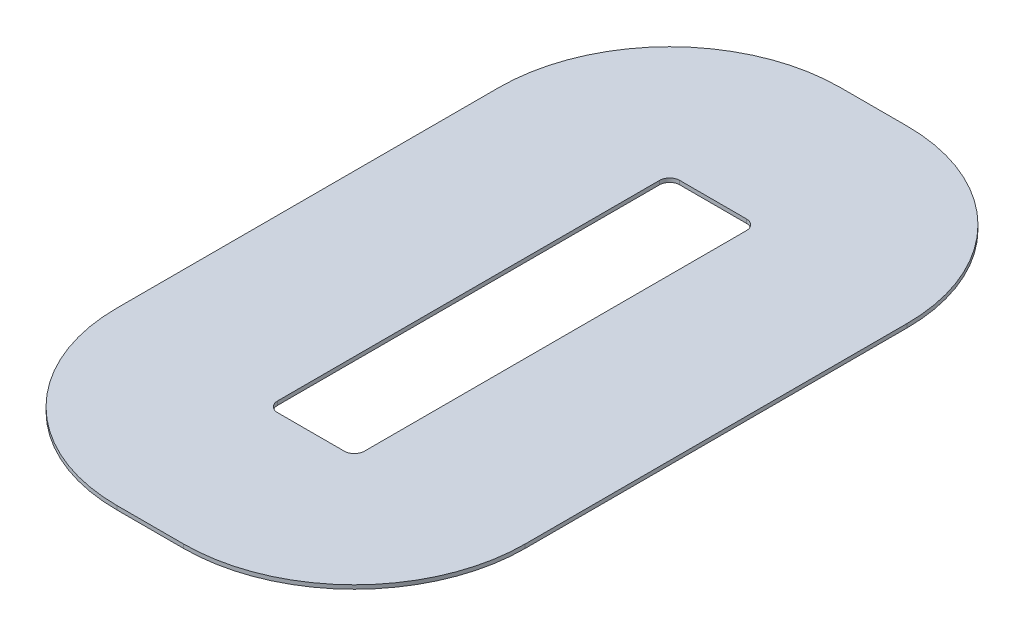
ISO-10303-21;
HEADER;
FILE_DESCRIPTION(('STEP AP214'),'2;1');
FILE_NAME('part.step','',(''),(''),'','','');
FILE_SCHEMA(('AUTOMOTIVE_DESIGN { 1 0 10303 214 1 1 1 1 }'));
ENDSEC;
DATA;
#1=APPLICATION_CONTEXT('core data for automotive mechanical design processes');
#2=APPLICATION_PROTOCOL_DEFINITION('international standard','automotive_design',2000,#1);
#3=PRODUCT_CONTEXT('',#1,'mechanical');
#4=PRODUCT('Part','Part','',(#3));
#5=PRODUCT_RELATED_PRODUCT_CATEGORY('part','',(#4));
#6=PRODUCT_DEFINITION_FORMATION('','',#4);
#7=PRODUCT_DEFINITION_CONTEXT('part definition',#1,'design');
#8=PRODUCT_DEFINITION('design','',#6,#7);
#9=PRODUCT_DEFINITION_SHAPE('','',#8);
#10=(LENGTH_UNIT() NAMED_UNIT(*) SI_UNIT(.MILLI.,.METRE.));
#11=(NAMED_UNIT(*) PLANE_ANGLE_UNIT() SI_UNIT($,.RADIAN.));
#12=(NAMED_UNIT(*) SI_UNIT($,.STERADIAN.) SOLID_ANGLE_UNIT());
#13=UNCERTAINTY_MEASURE_WITH_UNIT(LENGTH_MEASURE(1.E-05),#10,'distance_accuracy_value','');
#14=(GEOMETRIC_REPRESENTATION_CONTEXT(3) GLOBAL_UNCERTAINTY_ASSIGNED_CONTEXT((#13)) GLOBAL_UNIT_ASSIGNED_CONTEXT((#10,
#11,#12)) REPRESENTATION_CONTEXT('',''));
#15=CARTESIAN_POINT('',(0.,0.,0.));
#16=DIRECTION('',(0.,0.,1.));
#17=DIRECTION('',(1.,0.,0.));
#18=AXIS2_PLACEMENT_3D('',#15,#16,#17);
#19=CARTESIAN_POINT('',(4.30000000000001,-0.5,-24.6));
#20=DIRECTION('',(0.,1.,0.));
#21=DIRECTION('',(0.,0.,1.));
#22=AXIS2_PLACEMENT_3D('',#19,#20,#21);
#23=CYLINDRICAL_SURFACE('',#22,22.);
#24=CARTESIAN_POINT('',(4.30000000000001,0.,-24.6));
#25=DIRECTION('',(0.,1.,0.));
#26=DIRECTION('',(0.,0.,-1.));
#27=AXIS2_PLACEMENT_3D('',#24,#25,#26);
#28=CIRCLE('',#27,22.);
#29=CARTESIAN_POINT('',(26.3,0.,-24.5999999999998));
#30=VERTEX_POINT('',#29);
#31=CARTESIAN_POINT('',(4.29999999999985,0.,-46.6));
#32=VERTEX_POINT('',#31);
#33=EDGE_CURVE('E210',#30,#32,#28,.T.);
#34=ORIENTED_EDGE('',*,*,#33,.F.);
#35=DIRECTION('',(0.,1.,0.));
#36=VECTOR('',#35,1.);
#37=CARTESIAN_POINT('',(26.3,-0.5,-24.5999999999998));
#38=LINE('',#37,#36);
#39=CARTESIAN_POINT('',(26.3,-0.5,-24.5999999999998));
#40=VERTEX_POINT('',#39);
#41=EDGE_CURVE('E11',#40,#30,#38,.T.);
#42=ORIENTED_EDGE('',*,*,#41,.F.);
#43=CARTESIAN_POINT('',(4.30000000000001,-0.5,-24.6));
#44=DIRECTION('',(0.,1.,0.));
#45=DIRECTION('',(0.,0.,-1.));
#46=AXIS2_PLACEMENT_3D('',#43,#44,#45);
#47=CIRCLE('',#46,22.);
#48=CARTESIAN_POINT('',(4.29999999999985,-0.5,-46.6));
#49=VERTEX_POINT('',#48);
#50=EDGE_CURVE('E222',#40,#49,#47,.T.);
#51=ORIENTED_EDGE('',*,*,#50,.T.);
#52=DIRECTION('',(0.,1.,0.));
#53=VECTOR('',#52,1.);
#54=CARTESIAN_POINT('',(4.29999999999985,-0.5,-46.6));
#55=LINE('',#54,#53);
#56=EDGE_CURVE('E43',#49,#32,#55,.T.);
#57=ORIENTED_EDGE('',*,*,#56,.T.);
#58=EDGE_LOOP('',(#34,#42,#51,#57));
#59=FACE_BOUND('',#58,.T.);
#60=ADVANCED_FACE('F40',(#59),#23,.T.);
#61=CARTESIAN_POINT('',(26.3,-0.5,-24.5999999999998));
#62=DIRECTION('',(1.,0.,0.));
#63=DIRECTION('',(0.,0.,-1.));
#64=AXIS2_PLACEMENT_3D('',#61,#62,#63);
#65=PLANE('',#64);
#66=DIRECTION('',(0.,0.,-1.));
#67=VECTOR('',#66,1.);
#68=CARTESIAN_POINT('',(26.3,0.,-24.5999999999998));
#69=LINE('',#68,#67);
#70=CARTESIAN_POINT('',(26.3,0.,24.5999999999999));
#71=VERTEX_POINT('',#70);
#72=EDGE_CURVE('E226',#71,#30,#69,.T.);
#73=ORIENTED_EDGE('',*,*,#72,.F.);
#74=DIRECTION('',(0.,1.,0.));
#75=VECTOR('',#74,1.);
#76=CARTESIAN_POINT('',(26.3,-0.5,24.5999999999999));
#77=LINE('',#76,#75);
#78=CARTESIAN_POINT('',(26.3,-0.5,24.5999999999999));
#79=VERTEX_POINT('',#78);
#80=EDGE_CURVE('E48',#79,#71,#77,.T.);
#81=ORIENTED_EDGE('',*,*,#80,.F.);
#82=DIRECTION('',(0.,0.,-1.));
#83=VECTOR('',#82,1.);
#84=CARTESIAN_POINT('',(26.3,-0.5,-24.5999999999998));
#85=LINE('',#84,#83);
#86=EDGE_CURVE('E244',#79,#40,#85,.T.);
#87=ORIENTED_EDGE('',*,*,#86,.T.);
#88=ORIENTED_EDGE('',*,*,#41,.T.);
#89=EDGE_LOOP('',(#73,#81,#87,#88));
#90=FACE_BOUND('',#89,.T.);
#91=ADVANCED_FACE('F291',(#90),#65,.T.);
#92=CARTESIAN_POINT('',(4.30000000000001,-0.5,24.6));
#93=DIRECTION('',(0.,1.,0.));
#94=DIRECTION('',(0.,0.,1.));
#95=AXIS2_PLACEMENT_3D('',#92,#93,#94);
#96=CYLINDRICAL_SURFACE('',#95,22.);
#97=CARTESIAN_POINT('',(4.30000000000001,0.,24.6));
#98=DIRECTION('',(0.,1.,0.));
#99=DIRECTION('',(0.,0.,1.));
#100=AXIS2_PLACEMENT_3D('',#97,#98,#99);
#101=CIRCLE('',#100,22.);
#102=CARTESIAN_POINT('',(4.29999999999985,0.,46.6));
#103=VERTEX_POINT('',#102);
#104=EDGE_CURVE('E264',#103,#71,#101,.T.);
#105=ORIENTED_EDGE('',*,*,#104,.F.);
#106=DIRECTION('',(0.,1.,0.));
#107=VECTOR('',#106,1.);
#108=CARTESIAN_POINT('',(4.29999999999985,-0.5,46.6));
#109=LINE('',#108,#107);
#110=CARTESIAN_POINT('',(4.29999999999985,-0.5,46.6));
#111=VERTEX_POINT('',#110);
#112=EDGE_CURVE('E270',#111,#103,#109,.T.);
#113=ORIENTED_EDGE('',*,*,#112,.F.);
#114=CARTESIAN_POINT('',(4.30000000000001,-0.5,24.6));
#115=DIRECTION('',(0.,1.,0.));
#116=DIRECTION('',(0.,0.,1.));
#117=AXIS2_PLACEMENT_3D('',#114,#115,#116);
#118=CIRCLE('',#117,22.);
#119=EDGE_CURVE('E241',#111,#79,#118,.T.);
#120=ORIENTED_EDGE('',*,*,#119,.T.);
#121=ORIENTED_EDGE('',*,*,#80,.T.);
#122=EDGE_LOOP('',(#105,#113,#120,#121));
#123=FACE_BOUND('',#122,.T.);
#124=ADVANCED_FACE('F310',(#123),#96,.T.);
#125=CARTESIAN_POINT('',(-4.29999999999984,-0.5,46.6));
#126=DIRECTION('',(0.,0.,1.));
#127=DIRECTION('',(1.,0.,0.));
#128=AXIS2_PLACEMENT_3D('',#125,#126,#127);
#129=PLANE('',#128);
#130=DIRECTION('',(1.,0.,0.));
#131=VECTOR('',#130,1.);
#132=CARTESIAN_POINT('',(-4.29999999999984,0.,46.6));
#133=LINE('',#132,#131);
#134=CARTESIAN_POINT('',(-4.29999999999999,0.,46.6));
#135=VERTEX_POINT('',#134);
#136=EDGE_CURVE('E261',#135,#103,#133,.T.);
#137=ORIENTED_EDGE('',*,*,#136,.F.);
#138=DIRECTION('',(0.,1.,0.));
#139=VECTOR('',#138,1.);
#140=CARTESIAN_POINT('',(-4.29999999999999,-0.5,46.6));
#141=LINE('',#140,#139);
#142=CARTESIAN_POINT('',(-4.29999999999999,-0.5,46.6));
#143=VERTEX_POINT('',#142);
#144=EDGE_CURVE('E272',#143,#135,#141,.T.);
#145=ORIENTED_EDGE('',*,*,#144,.F.);
#146=DIRECTION('',(1.,0.,0.));
#147=VECTOR('',#146,1.);
#148=CARTESIAN_POINT('',(-4.29999999999984,-0.5,46.6));
#149=LINE('',#148,#147);
#150=EDGE_CURVE('E238',#143,#111,#149,.T.);
#151=ORIENTED_EDGE('',*,*,#150,.T.);
#152=ORIENTED_EDGE('',*,*,#112,.T.);
#153=EDGE_LOOP('',(#137,#145,#151,#152));
#154=FACE_BOUND('',#153,.T.);
#155=ADVANCED_FACE('F308',(#154),#129,.T.);
#156=CARTESIAN_POINT('',(-4.29999999999999,-0.5,24.6));
#157=DIRECTION('',(0.,1.,0.));
#158=DIRECTION('',(0.,0.,1.));
#159=AXIS2_PLACEMENT_3D('',#156,#157,#158);
#160=CYLINDRICAL_SURFACE('',#159,22.);
#161=CARTESIAN_POINT('',(-4.29999999999999,0.,24.6));
#162=DIRECTION('',(0.,1.,0.));
#163=DIRECTION('',(0.,0.,1.));
#164=AXIS2_PLACEMENT_3D('',#161,#162,#163);
#165=CIRCLE('',#164,22.);
#166=CARTESIAN_POINT('',(-26.3,0.,24.5999999999999));
#167=VERTEX_POINT('',#166);
#168=EDGE_CURVE('E258',#167,#135,#165,.T.);
#169=ORIENTED_EDGE('',*,*,#168,.F.);
#170=DIRECTION('',(0.,1.,0.));
#171=VECTOR('',#170,1.);
#172=CARTESIAN_POINT('',(-26.3,-0.5,24.5999999999999));
#173=LINE('',#172,#171);
#174=CARTESIAN_POINT('',(-26.3,-0.5,24.5999999999999));
#175=VERTEX_POINT('',#174);
#176=EDGE_CURVE('E274',#175,#167,#173,.T.);
#177=ORIENTED_EDGE('',*,*,#176,.F.);
#178=CARTESIAN_POINT('',(-4.29999999999999,-0.5,24.6));
#179=DIRECTION('',(0.,1.,0.));
#180=DIRECTION('',(0.,0.,1.));
#181=AXIS2_PLACEMENT_3D('',#178,#179,#180);
#182=CIRCLE('',#181,22.);
#183=EDGE_CURVE('E235',#175,#143,#182,.T.);
#184=ORIENTED_EDGE('',*,*,#183,.T.);
#185=ORIENTED_EDGE('',*,*,#144,.T.);
#186=EDGE_LOOP('',(#169,#177,#184,#185));
#187=FACE_BOUND('',#186,.T.);
#188=ADVANCED_FACE('F304',(#187),#160,.T.);
#189=CARTESIAN_POINT('',(-26.3,-0.5,-24.5999999999998));
#190=DIRECTION('',(-1.,0.,0.));
#191=DIRECTION('',(0.,0.,1.));
#192=AXIS2_PLACEMENT_3D('',#189,#190,#191);
#193=PLANE('',#192);
#194=DIRECTION('',(0.,0.,1.));
#195=VECTOR('',#194,1.);
#196=CARTESIAN_POINT('',(-26.3,0.,-24.5999999999998));
#197=LINE('',#196,#195);
#198=CARTESIAN_POINT('',(-26.3,0.,-24.5999999999999));
#199=VERTEX_POINT('',#198);
#200=EDGE_CURVE('E255',#199,#167,#197,.T.);
#201=ORIENTED_EDGE('',*,*,#200,.F.);
#202=DIRECTION('',(0.,1.,0.));
#203=VECTOR('',#202,1.);
#204=CARTESIAN_POINT('',(-26.3,-0.5,-24.5999999999999));
#205=LINE('',#204,#203);
#206=CARTESIAN_POINT('',(-26.3,-0.5,-24.5999999999999));
#207=VERTEX_POINT('',#206);
#208=EDGE_CURVE('E276',#207,#199,#205,.T.);
#209=ORIENTED_EDGE('',*,*,#208,.F.);
#210=DIRECTION('',(0.,0.,1.));
#211=VECTOR('',#210,1.);
#212=CARTESIAN_POINT('',(-26.3,-0.5,-24.5999999999998));
#213=LINE('',#212,#211);
#214=EDGE_CURVE('E232',#207,#175,#213,.T.);
#215=ORIENTED_EDGE('',*,*,#214,.T.);
#216=ORIENTED_EDGE('',*,*,#176,.T.);
#217=EDGE_LOOP('',(#201,#209,#215,#216));
#218=FACE_BOUND('',#217,.T.);
#219=ADVANCED_FACE('F302',(#218),#193,.T.);
#220=CARTESIAN_POINT('',(-4.30000000000001,-0.5,-24.6));
#221=DIRECTION('',(0.,1.,0.));
#222=DIRECTION('',(0.,0.,1.));
#223=AXIS2_PLACEMENT_3D('',#220,#221,#222);
#224=CYLINDRICAL_SURFACE('',#223,22.);
#225=CARTESIAN_POINT('',(-4.30000000000001,0.,-24.6));
#226=DIRECTION('',(0.,1.,0.));
#227=DIRECTION('',(0.,0.,1.));
#228=AXIS2_PLACEMENT_3D('',#225,#226,#227);
#229=CIRCLE('',#228,22.);
#230=CARTESIAN_POINT('',(-4.29999999999985,0.,-46.6));
#231=VERTEX_POINT('',#230);
#232=EDGE_CURVE('E252',#231,#199,#229,.T.);
#233=ORIENTED_EDGE('',*,*,#232,.F.);
#234=DIRECTION('',(0.,1.,0.));
#235=VECTOR('',#234,1.);
#236=CARTESIAN_POINT('',(-4.29999999999985,-0.5,-46.6));
#237=LINE('',#236,#235);
#238=CARTESIAN_POINT('',(-4.29999999999985,-0.5,-46.6));
#239=VERTEX_POINT('',#238);
#240=EDGE_CURVE('E277',#239,#231,#237,.T.);
#241=ORIENTED_EDGE('',*,*,#240,.F.);
#242=CARTESIAN_POINT('',(-4.30000000000001,-0.5,-24.6));
#243=DIRECTION('',(0.,1.,0.));
#244=DIRECTION('',(0.,0.,1.));
#245=AXIS2_PLACEMENT_3D('',#242,#243,#244);
#246=CIRCLE('',#245,22.);
#247=EDGE_CURVE('E229',#239,#207,#246,.T.);
#248=ORIENTED_EDGE('',*,*,#247,.T.);
#249=ORIENTED_EDGE('',*,*,#208,.T.);
#250=EDGE_LOOP('',(#233,#241,#248,#249));
#251=FACE_BOUND('',#250,.T.);
#252=ADVANCED_FACE('F298',(#251),#224,.T.);
#253=CARTESIAN_POINT('',(-4.29999999999985,-0.5,-46.6));
#254=DIRECTION('',(0.,0.,-1.));
#255=DIRECTION('',(-1.,0.,0.));
#256=AXIS2_PLACEMENT_3D('',#253,#254,#255);
#257=PLANE('',#256);
#258=DIRECTION('',(-1.,0.,0.));
#259=VECTOR('',#258,1.);
#260=CARTESIAN_POINT('',(-4.29999999999985,0.,-46.6));
#261=LINE('',#260,#259);
#262=EDGE_CURVE('E249',#32,#231,#261,.T.);
#263=ORIENTED_EDGE('',*,*,#262,.F.);
#264=ORIENTED_EDGE('',*,*,#56,.F.);
#265=DIRECTION('',(-1.,0.,0.));
#266=VECTOR('',#265,1.);
#267=CARTESIAN_POINT('',(-4.29999999999985,-0.5,-46.6));
#268=LINE('',#267,#266);
#269=EDGE_CURVE('E225',#49,#239,#268,.T.);
#270=ORIENTED_EDGE('',*,*,#269,.T.);
#271=ORIENTED_EDGE('',*,*,#240,.T.);
#272=EDGE_LOOP('',(#263,#264,#270,#271));
#273=FACE_BOUND('',#272,.T.);
#274=ADVANCED_FACE('F285',(#273),#257,.T.);
#275=CARTESIAN_POINT('',(4.30000000000001,-0.5,-24.6));
#276=DIRECTION('',(0.,-1.,0.));
#277=DIRECTION('',(0.,0.,-1.));
#278=AXIS2_PLACEMENT_3D('',#275,#276,#277);
#279=PLANE('',#278);
#280=CARTESIAN_POINT('',(4.30000000000001,-0.5,24.6));
#281=DIRECTION('',(0.,1.,0.));
#282=DIRECTION('',(0.,0.,1.));
#283=AXIS2_PLACEMENT_3D('',#280,#281,#282);
#284=CIRCLE('',#283,1.3);
#285=CARTESIAN_POINT('',(4.3,-0.5,25.9));
#286=VERTEX_POINT('',#285);
#287=CARTESIAN_POINT('',(5.60000000000001,-0.5,24.6));
#288=VERTEX_POINT('',#287);
#289=EDGE_CURVE('E155',#286,#288,#284,.T.);
#290=ORIENTED_EDGE('',*,*,#289,.T.);
#291=DIRECTION('',(0.,0.,-1.));
#292=VECTOR('',#291,1.);
#293=CARTESIAN_POINT('',(5.6,-0.5,-24.6));
#294=LINE('',#293,#292);
#295=CARTESIAN_POINT('',(5.6,-0.5,-24.6));
#296=VERTEX_POINT('',#295);
#297=EDGE_CURVE('E164',#288,#296,#294,.T.);
#298=ORIENTED_EDGE('',*,*,#297,.T.);
#299=CARTESIAN_POINT('',(4.3,-0.5,-24.6));
#300=DIRECTION('',(0.,1.,0.));
#301=DIRECTION('',(0.,0.,-1.));
#302=AXIS2_PLACEMENT_3D('',#299,#300,#301);
#303=CIRCLE('',#302,1.3);
#304=CARTESIAN_POINT('',(4.29999999999999,-0.5,-25.9));
#305=VERTEX_POINT('',#304);
#306=EDGE_CURVE('E56',#296,#305,#303,.T.);
#307=ORIENTED_EDGE('',*,*,#306,.T.);
#308=DIRECTION('',(-1.,0.,0.));
#309=VECTOR('',#308,1.);
#310=CARTESIAN_POINT('',(-4.3,-0.5,-25.9));
#311=LINE('',#310,#309);
#312=CARTESIAN_POINT('',(-4.3,-0.5,-25.9));
#313=VERTEX_POINT('',#312);
#314=EDGE_CURVE('E179',#305,#313,#311,.T.);
#315=ORIENTED_EDGE('',*,*,#314,.T.);
#316=CARTESIAN_POINT('',(-4.30000000000001,-0.5,-24.6));
#317=DIRECTION('',(0.,1.,0.));
#318=DIRECTION('',(0.,0.,1.));
#319=AXIS2_PLACEMENT_3D('',#316,#317,#318);
#320=CIRCLE('',#319,1.3);
#321=CARTESIAN_POINT('',(-5.60000000000001,-0.5,-24.6));
#322=VERTEX_POINT('',#321);
#323=EDGE_CURVE('E182',#313,#322,#320,.T.);
#324=ORIENTED_EDGE('',*,*,#323,.T.);
#325=DIRECTION('',(0.,0.,1.));
#326=VECTOR('',#325,1.);
#327=CARTESIAN_POINT('',(-5.60000000000001,-0.5,-24.6));
#328=LINE('',#327,#326);
#329=CARTESIAN_POINT('',(-5.6,-0.5,24.6));
#330=VERTEX_POINT('',#329);
#331=EDGE_CURVE('E185',#322,#330,#328,.T.);
#332=ORIENTED_EDGE('',*,*,#331,.T.);
#333=CARTESIAN_POINT('',(-4.3,-0.5,24.6));
#334=DIRECTION('',(0.,1.,0.));
#335=DIRECTION('',(0.,0.,1.));
#336=AXIS2_PLACEMENT_3D('',#333,#334,#335);
#337=CIRCLE('',#336,1.3);
#338=CARTESIAN_POINT('',(-4.29999999999999,-0.5,25.9));
#339=VERTEX_POINT('',#338);
#340=EDGE_CURVE('E188',#330,#339,#337,.T.);
#341=ORIENTED_EDGE('',*,*,#340,.T.);
#342=DIRECTION('',(1.,0.,0.));
#343=VECTOR('',#342,1.);
#344=CARTESIAN_POINT('',(-4.29999999999999,-0.5,25.9));
#345=LINE('',#344,#343);
#346=EDGE_CURVE('E161',#339,#286,#345,.T.);
#347=ORIENTED_EDGE('',*,*,#346,.T.);
#348=EDGE_LOOP('',(#290,#298,#307,#315,#324,#332,#341,#347));
#349=FACE_BOUND('',#348,.T.);
#350=ORIENTED_EDGE('',*,*,#50,.F.);
#351=ORIENTED_EDGE('',*,*,#86,.F.);
#352=ORIENTED_EDGE('',*,*,#119,.F.);
#353=ORIENTED_EDGE('',*,*,#150,.F.);
#354=ORIENTED_EDGE('',*,*,#183,.F.);
#355=ORIENTED_EDGE('',*,*,#214,.F.);
#356=ORIENTED_EDGE('',*,*,#247,.F.);
#357=ORIENTED_EDGE('',*,*,#269,.F.);
#358=EDGE_LOOP('',(#350,#351,#352,#353,#354,#355,#356,#357));
#359=FACE_BOUND('',#358,.T.);
#360=ADVANCED_FACE('F168',(#349,#359),#279,.T.);
#361=CARTESIAN_POINT('',(4.30000000000001,0.,-24.6));
#362=DIRECTION('',(0.,-1.,0.));
#363=DIRECTION('',(0.,0.,-1.));
#364=AXIS2_PLACEMENT_3D('',#361,#362,#363);
#365=PLANE('',#364);
#366=DIRECTION('',(0.,0.,-1.));
#367=VECTOR('',#366,1.);
#368=CARTESIAN_POINT('',(5.6,0.,-24.6));
#369=LINE('',#368,#367);
#370=CARTESIAN_POINT('',(5.60000000000001,0.,24.6));
#371=VERTEX_POINT('',#370);
#372=CARTESIAN_POINT('',(5.6,0.,-24.6));
#373=VERTEX_POINT('',#372);
#374=EDGE_CURVE('E192',#371,#373,#369,.T.);
#375=ORIENTED_EDGE('',*,*,#374,.F.);
#376=CARTESIAN_POINT('',(4.30000000000001,0.,24.6));
#377=DIRECTION('',(0.,1.,0.));
#378=DIRECTION('',(0.,0.,1.));
#379=AXIS2_PLACEMENT_3D('',#376,#377,#378);
#380=CIRCLE('',#379,1.3);
#381=CARTESIAN_POINT('',(4.3,0.,25.9));
#382=VERTEX_POINT('',#381);
#383=EDGE_CURVE('E64',#382,#371,#380,.T.);
#384=ORIENTED_EDGE('',*,*,#383,.F.);
#385=DIRECTION('',(1.,0.,0.));
#386=VECTOR('',#385,1.);
#387=CARTESIAN_POINT('',(-4.29999999999999,0.,25.9));
#388=LINE('',#387,#386);
#389=CARTESIAN_POINT('',(-4.29999999999999,0.,25.9));
#390=VERTEX_POINT('',#389);
#391=EDGE_CURVE('E172',#390,#382,#388,.T.);
#392=ORIENTED_EDGE('',*,*,#391,.F.);
#393=CARTESIAN_POINT('',(-4.3,0.,24.6));
#394=DIRECTION('',(0.,1.,0.));
#395=DIRECTION('',(0.,0.,1.));
#396=AXIS2_PLACEMENT_3D('',#393,#394,#395);
#397=CIRCLE('',#396,1.3);
#398=CARTESIAN_POINT('',(-5.6,0.,24.6));
#399=VERTEX_POINT('',#398);
#400=EDGE_CURVE('E175',#399,#390,#397,.T.);
#401=ORIENTED_EDGE('',*,*,#400,.F.);
#402=DIRECTION('',(0.,0.,1.));
#403=VECTOR('',#402,1.);
#404=CARTESIAN_POINT('',(-5.60000000000001,0.,-24.6));
#405=LINE('',#404,#403);
#406=CARTESIAN_POINT('',(-5.60000000000001,0.,-24.6));
#407=VERTEX_POINT('',#406);
#408=EDGE_CURVE('E203',#407,#399,#405,.T.);
#409=ORIENTED_EDGE('',*,*,#408,.F.);
#410=CARTESIAN_POINT('',(-4.30000000000001,0.,-24.6));
#411=DIRECTION('',(0.,1.,0.));
#412=DIRECTION('',(0.,0.,1.));
#413=AXIS2_PLACEMENT_3D('',#410,#411,#412);
#414=CIRCLE('',#413,1.3);
#415=CARTESIAN_POINT('',(-4.3,0.,-25.9));
#416=VERTEX_POINT('',#415);
#417=EDGE_CURVE('E200',#416,#407,#414,.T.);
#418=ORIENTED_EDGE('',*,*,#417,.F.);
#419=DIRECTION('',(-1.,0.,0.));
#420=VECTOR('',#419,1.);
#421=CARTESIAN_POINT('',(-4.3,0.,-25.9));
#422=LINE('',#421,#420);
#423=CARTESIAN_POINT('',(4.29999999999999,0.,-25.9));
#424=VERTEX_POINT('',#423);
#425=EDGE_CURVE('E197',#424,#416,#422,.T.);
#426=ORIENTED_EDGE('',*,*,#425,.F.);
#427=CARTESIAN_POINT('',(4.3,0.,-24.6));
#428=DIRECTION('',(0.,1.,0.));
#429=DIRECTION('',(0.,0.,-1.));
#430=AXIS2_PLACEMENT_3D('',#427,#428,#429);
#431=CIRCLE('',#430,1.3);
#432=EDGE_CURVE('E194',#373,#424,#431,.T.);
#433=ORIENTED_EDGE('',*,*,#432,.F.);
#434=EDGE_LOOP('',(#375,#384,#392,#401,#409,#418,#426,#433));
#435=FACE_BOUND('',#434,.T.);
#436=ORIENTED_EDGE('',*,*,#33,.T.);
#437=ORIENTED_EDGE('',*,*,#262,.T.);
#438=ORIENTED_EDGE('',*,*,#232,.T.);
#439=ORIENTED_EDGE('',*,*,#200,.T.);
#440=ORIENTED_EDGE('',*,*,#168,.T.);
#441=ORIENTED_EDGE('',*,*,#136,.T.);
#442=ORIENTED_EDGE('',*,*,#104,.T.);
#443=ORIENTED_EDGE('',*,*,#72,.T.);
#444=EDGE_LOOP('',(#436,#437,#438,#439,#440,#441,#442,#443));
#445=FACE_BOUND('',#444,.T.);
#446=ADVANCED_FACE('F287',(#435,#445),#365,.F.);
#447=CARTESIAN_POINT('',(4.30000000000001,-0.5,24.6));
#448=DIRECTION('',(0.,1.,0.));
#449=DIRECTION('',(0.,0.,1.));
#450=AXIS2_PLACEMENT_3D('',#447,#448,#449);
#451=CYLINDRICAL_SURFACE('',#450,1.3);
#452=ORIENTED_EDGE('',*,*,#383,.T.);
#453=DIRECTION('',(0.,1.,0.));
#454=VECTOR('',#453,1.);
#455=CARTESIAN_POINT('',(5.60000000000001,-0.5,24.6));
#456=LINE('',#455,#454);
#457=EDGE_CURVE('E151',#288,#371,#456,.T.);
#458=ORIENTED_EDGE('',*,*,#457,.F.);
#459=ORIENTED_EDGE('',*,*,#289,.F.);
#460=DIRECTION('',(0.,1.,0.));
#461=VECTOR('',#460,1.);
#462=CARTESIAN_POINT('',(4.3,-0.5,25.9));
#463=LINE('',#462,#461);
#464=EDGE_CURVE('E208',#286,#382,#463,.T.);
#465=ORIENTED_EDGE('',*,*,#464,.T.);
#466=EDGE_LOOP('',(#452,#458,#459,#465));
#467=FACE_BOUND('',#466,.T.);
#468=ADVANCED_FACE('F153',(#467),#451,.F.);
#469=CARTESIAN_POINT('',(-4.29999999999999,-0.5,25.9));
#470=DIRECTION('',(0.,0.,1.));
#471=DIRECTION('',(1.,0.,0.));
#472=AXIS2_PLACEMENT_3D('',#469,#470,#471);
#473=PLANE('',#472);
#474=ORIENTED_EDGE('',*,*,#391,.T.);
#475=ORIENTED_EDGE('',*,*,#464,.F.);
#476=ORIENTED_EDGE('',*,*,#346,.F.);
#477=DIRECTION('',(0.,1.,0.));
#478=VECTOR('',#477,1.);
#479=CARTESIAN_POINT('',(-4.29999999999999,-0.5,25.9));
#480=LINE('',#479,#478);
#481=EDGE_CURVE('E211',#339,#390,#480,.T.);
#482=ORIENTED_EDGE('',*,*,#481,.T.);
#483=EDGE_LOOP('',(#474,#475,#476,#482));
#484=FACE_BOUND('',#483,.T.);
#485=ADVANCED_FACE('F402',(#484),#473,.F.);
#486=CARTESIAN_POINT('',(-4.3,-0.5,24.6));
#487=DIRECTION('',(0.,1.,0.));
#488=DIRECTION('',(0.,0.,1.));
#489=AXIS2_PLACEMENT_3D('',#486,#487,#488);
#490=CYLINDRICAL_SURFACE('',#489,1.3);
#491=ORIENTED_EDGE('',*,*,#400,.T.);
#492=ORIENTED_EDGE('',*,*,#481,.F.);
#493=ORIENTED_EDGE('',*,*,#340,.F.);
#494=DIRECTION('',(0.,1.,0.));
#495=VECTOR('',#494,1.);
#496=CARTESIAN_POINT('',(-5.6,-0.5,24.6));
#497=LINE('',#496,#495);
#498=EDGE_CURVE('E213',#330,#399,#497,.T.);
#499=ORIENTED_EDGE('',*,*,#498,.T.);
#500=EDGE_LOOP('',(#491,#492,#493,#499));
#501=FACE_BOUND('',#500,.T.);
#502=ADVANCED_FACE('F412',(#501),#490,.F.);
#503=CARTESIAN_POINT('',(-5.60000000000001,-0.5,-24.6));
#504=DIRECTION('',(-1.,0.,0.));
#505=DIRECTION('',(0.,0.,1.));
#506=AXIS2_PLACEMENT_3D('',#503,#504,#505);
#507=PLANE('',#506);
#508=ORIENTED_EDGE('',*,*,#408,.T.);
#509=ORIENTED_EDGE('',*,*,#498,.F.);
#510=ORIENTED_EDGE('',*,*,#331,.F.);
#511=DIRECTION('',(0.,1.,0.));
#512=VECTOR('',#511,1.);
#513=CARTESIAN_POINT('',(-5.60000000000001,-0.5,-24.6));
#514=LINE('',#513,#512);
#515=EDGE_CURVE('E215',#322,#407,#514,.T.);
#516=ORIENTED_EDGE('',*,*,#515,.T.);
#517=EDGE_LOOP('',(#508,#509,#510,#516));
#518=FACE_BOUND('',#517,.T.);
#519=ADVANCED_FACE('F423',(#518),#507,.F.);
#520=CARTESIAN_POINT('',(-4.30000000000001,-0.5,-24.6));
#521=DIRECTION('',(0.,1.,0.));
#522=DIRECTION('',(0.,0.,1.));
#523=AXIS2_PLACEMENT_3D('',#520,#521,#522);
#524=CYLINDRICAL_SURFACE('',#523,1.3);
#525=ORIENTED_EDGE('',*,*,#417,.T.);
#526=ORIENTED_EDGE('',*,*,#515,.F.);
#527=ORIENTED_EDGE('',*,*,#323,.F.);
#528=DIRECTION('',(0.,1.,0.));
#529=VECTOR('',#528,1.);
#530=CARTESIAN_POINT('',(-4.3,-0.5,-25.9));
#531=LINE('',#530,#529);
#532=EDGE_CURVE('E217',#313,#416,#531,.T.);
#533=ORIENTED_EDGE('',*,*,#532,.T.);
#534=EDGE_LOOP('',(#525,#526,#527,#533));
#535=FACE_BOUND('',#534,.T.);
#536=ADVANCED_FACE('F434',(#535),#524,.F.);
#537=CARTESIAN_POINT('',(-4.3,-0.5,-25.9));
#538=DIRECTION('',(0.,0.,-1.));
#539=DIRECTION('',(-1.,0.,0.));
#540=AXIS2_PLACEMENT_3D('',#537,#538,#539);
#541=PLANE('',#540);
#542=ORIENTED_EDGE('',*,*,#425,.T.);
#543=ORIENTED_EDGE('',*,*,#532,.F.);
#544=ORIENTED_EDGE('',*,*,#314,.F.);
#545=DIRECTION('',(0.,1.,0.));
#546=VECTOR('',#545,1.);
#547=CARTESIAN_POINT('',(4.29999999999999,-0.5,-25.9));
#548=LINE('',#547,#546);
#549=EDGE_CURVE('E219',#305,#424,#548,.T.);
#550=ORIENTED_EDGE('',*,*,#549,.T.);
#551=EDGE_LOOP('',(#542,#543,#544,#550));
#552=FACE_BOUND('',#551,.T.);
#553=ADVANCED_FACE('F445',(#552),#541,.F.);
#554=CARTESIAN_POINT('',(4.3,-0.5,-24.6));
#555=DIRECTION('',(0.,1.,0.));
#556=DIRECTION('',(0.,0.,1.));
#557=AXIS2_PLACEMENT_3D('',#554,#555,#556);
#558=CYLINDRICAL_SURFACE('',#557,1.3);
#559=ORIENTED_EDGE('',*,*,#432,.T.);
#560=ORIENTED_EDGE('',*,*,#549,.F.);
#561=ORIENTED_EDGE('',*,*,#306,.F.);
#562=DIRECTION('',(0.,1.,0.));
#563=VECTOR('',#562,1.);
#564=CARTESIAN_POINT('',(5.6,-0.5,-24.6));
#565=LINE('',#564,#563);
#566=EDGE_CURVE('E160',#296,#373,#565,.T.);
#567=ORIENTED_EDGE('',*,*,#566,.T.);
#568=EDGE_LOOP('',(#559,#560,#561,#567));
#569=FACE_BOUND('',#568,.T.);
#570=ADVANCED_FACE('F456',(#569),#558,.F.);
#571=CARTESIAN_POINT('',(5.6,-0.5,-24.6));
#572=DIRECTION('',(1.,0.,0.));
#573=DIRECTION('',(0.,0.,-1.));
#574=AXIS2_PLACEMENT_3D('',#571,#572,#573);
#575=PLANE('',#574);
#576=ORIENTED_EDGE('',*,*,#374,.T.);
#577=ORIENTED_EDGE('',*,*,#566,.F.);
#578=ORIENTED_EDGE('',*,*,#297,.F.);
#579=ORIENTED_EDGE('',*,*,#457,.T.);
#580=EDGE_LOOP('',(#576,#577,#578,#579));
#581=FACE_BOUND('',#580,.T.);
#582=ADVANCED_FACE('F165',(#581),#575,.F.);
#583=CLOSED_SHELL('',(#60,#91,#124,#155,#188,#219,#252,#274,#360,#446,#468,#485,#502,#519,#536,
#553,#570,#582));
#584=MANIFOLD_SOLID_BREP('B2',#583);
#585=ADVANCED_BREP_SHAPE_REPRESENTATION('',(#18,#584),#14);
#586=SHAPE_DEFINITION_REPRESENTATION(#9,#585);
ENDSEC;
END-ISO-10303-21;
